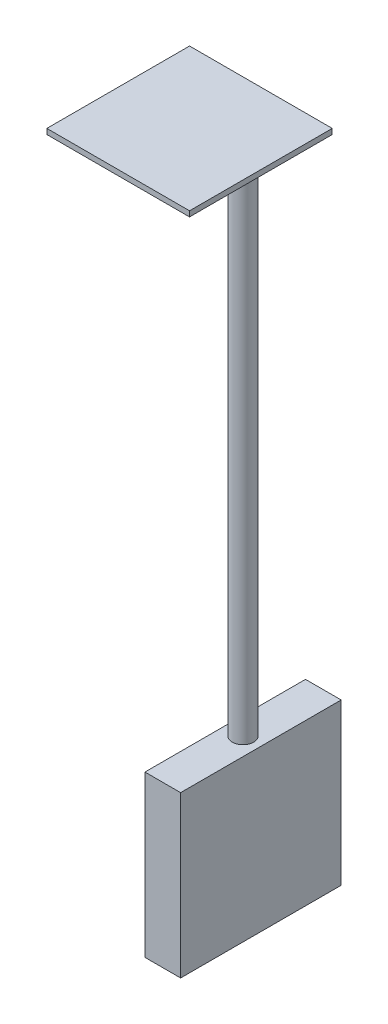
ISO-10303-21;
HEADER;
FILE_DESCRIPTION(('STEP AP214'),'2;1');
FILE_NAME('part.step','',(''),(''),'','','');
FILE_SCHEMA(('AUTOMOTIVE_DESIGN { 1 0 10303 214 1 1 1 1 }'));
ENDSEC;
DATA;
#1=APPLICATION_CONTEXT('core data for automotive mechanical design processes');
#2=APPLICATION_PROTOCOL_DEFINITION('international standard','automotive_design',2000,#1);
#3=PRODUCT_CONTEXT('',#1,'mechanical');
#4=PRODUCT('Part','Part','',(#3));
#5=PRODUCT_RELATED_PRODUCT_CATEGORY('part','',(#4));
#6=PRODUCT_DEFINITION_FORMATION('','',#4);
#7=PRODUCT_DEFINITION_CONTEXT('part definition',#1,'design');
#8=PRODUCT_DEFINITION('design','',#6,#7);
#9=PRODUCT_DEFINITION_SHAPE('','',#8);
#10=(LENGTH_UNIT() NAMED_UNIT(*) SI_UNIT(.MILLI.,.METRE.));
#11=(NAMED_UNIT(*) PLANE_ANGLE_UNIT() SI_UNIT($,.RADIAN.));
#12=(NAMED_UNIT(*) SI_UNIT($,.STERADIAN.) SOLID_ANGLE_UNIT());
#13=UNCERTAINTY_MEASURE_WITH_UNIT(LENGTH_MEASURE(1.E-05),#10,'distance_accuracy_value','');
#14=(GEOMETRIC_REPRESENTATION_CONTEXT(3) GLOBAL_UNCERTAINTY_ASSIGNED_CONTEXT((#13)) GLOBAL_UNIT_ASSIGNED_CONTEXT((#10,
#11,#12)) REPRESENTATION_CONTEXT('',''));
#15=CARTESIAN_POINT('',(0.,0.,0.));
#16=DIRECTION('',(0.,0.,1.));
#17=DIRECTION('',(1.,0.,0.));
#18=AXIS2_PLACEMENT_3D('',#15,#16,#17);
#19=CARTESIAN_POINT('',(20.,32.03596113666,-75.9293033438984));
#20=DIRECTION('',(0.,-1.,0.));
#21=DIRECTION('',(0.,0.,-1.));
#22=AXIS2_PLACEMENT_3D('',#19,#20,#21);
#23=PLANE('',#22);
#24=DIRECTION('',(0.,0.,1.));
#25=VECTOR('',#24,1.);
#26=CARTESIAN_POINT('',(0.,32.03596113666,-75.9293033438984));
#27=LINE('',#26,#25);
#28=CARTESIAN_POINT('',(0.,32.03596113666,-75.9293033438984));
#29=VERTEX_POINT('',#28);
#30=CARTESIAN_POINT('',(0.,32.0359611366599,14.0706966561016));
#31=VERTEX_POINT('',#30);
#32=EDGE_CURVE('E163',#29,#31,#27,.T.);
#33=ORIENTED_EDGE('',*,*,#32,.T.);
#34=DIRECTION('',(-1.,0.,0.));
#35=VECTOR('',#34,1.);
#36=CARTESIAN_POINT('',(20.,32.0359611366599,14.0706966561016));
#37=LINE('',#36,#35);
#38=CARTESIAN_POINT('',(20.,32.0359611366599,14.0706966561016));
#39=VERTEX_POINT('',#38);
#40=EDGE_CURVE('E170',#39,#31,#37,.T.);
#41=ORIENTED_EDGE('',*,*,#40,.F.);
#42=DIRECTION('',(0.,0.,1.));
#43=VECTOR('',#42,1.);
#44=CARTESIAN_POINT('',(20.,32.03596113666,-75.9293033438984));
#45=LINE('',#44,#43);
#46=CARTESIAN_POINT('',(20.,32.03596113666,-75.9293033438984));
#47=VERTEX_POINT('',#46);
#48=EDGE_CURVE('E81',#47,#39,#45,.T.);
#49=ORIENTED_EDGE('',*,*,#48,.F.);
#50=DIRECTION('',(-1.,0.,0.));
#51=VECTOR('',#50,1.);
#52=CARTESIAN_POINT('',(20.,32.03596113666,-75.9293033438984));
#53=LINE('',#52,#51);
#54=EDGE_CURVE('E41',#47,#29,#53,.T.);
#55=ORIENTED_EDGE('',*,*,#54,.T.);
#56=EDGE_LOOP('',(#33,#41,#49,#55));
#57=FACE_BOUND('',#56,.T.);
#58=CARTESIAN_POINT('',(10.,32.03596113666,-30.9293033438984));
#59=DIRECTION('',(0.,-1.,0.));
#60=DIRECTION('',(0.,0.,-1.));
#61=AXIS2_PLACEMENT_3D('',#58,#59,#60);
#62=CIRCLE('',#61,6.);
#63=CARTESIAN_POINT('',(10.,32.03596113666,-36.9293033438984));
#64=VERTEX_POINT('',#63);
#65=EDGE_CURVE('E11',#64,#64,#62,.F.);
#66=ORIENTED_EDGE('',*,*,#65,.F.);
#67=EDGE_LOOP('',(#66));
#68=FACE_BOUND('',#67,.T.);
#69=ADVANCED_FACE('F32',(#57,#68),#23,.F.);
#70=CARTESIAN_POINT('',(20.,32.03596113666,-75.9293033438984));
#71=DIRECTION('',(0.,0.,1.));
#72=DIRECTION('',(0.,-1.,0.));
#73=AXIS2_PLACEMENT_3D('',#70,#71,#72);
#74=PLANE('',#73);
#75=DIRECTION('',(0.,1.,0.));
#76=VECTOR('',#75,1.);
#77=CARTESIAN_POINT('',(0.,32.03596113666,-75.9293033438984));
#78=LINE('',#77,#76);
#79=CARTESIAN_POINT('',(0.,-57.96403886334,-75.9293033438984));
#80=VERTEX_POINT('',#79);
#81=EDGE_CURVE('E153',#80,#29,#78,.T.);
#82=ORIENTED_EDGE('',*,*,#81,.T.);
#83=ORIENTED_EDGE('',*,*,#54,.F.);
#84=DIRECTION('',(0.,1.,0.));
#85=VECTOR('',#84,1.);
#86=CARTESIAN_POINT('',(20.,32.03596113666,-75.9293033438984));
#87=LINE('',#86,#85);
#88=CARTESIAN_POINT('',(20.,-57.96403886334,-75.9293033438984));
#89=VERTEX_POINT('',#88);
#90=EDGE_CURVE('E154',#89,#47,#87,.T.);
#91=ORIENTED_EDGE('',*,*,#90,.F.);
#92=DIRECTION('',(-1.,0.,0.));
#93=VECTOR('',#92,1.);
#94=CARTESIAN_POINT('',(20.,-57.96403886334,-75.9293033438984));
#95=LINE('',#94,#93);
#96=EDGE_CURVE('E160',#89,#80,#95,.T.);
#97=ORIENTED_EDGE('',*,*,#96,.T.);
#98=EDGE_LOOP('',(#82,#83,#91,#97));
#99=FACE_BOUND('',#98,.T.);
#100=ADVANCED_FACE('F34',(#99),#74,.F.);
#101=CARTESIAN_POINT('',(20.,32.0359611366599,14.0706966561016));
#102=DIRECTION('',(0.,0.,-1.));
#103=DIRECTION('',(0.,1.,0.));
#104=AXIS2_PLACEMENT_3D('',#101,#102,#103);
#105=PLANE('',#104);
#106=DIRECTION('',(0.,-1.,0.));
#107=VECTOR('',#106,1.);
#108=CARTESIAN_POINT('',(0.,32.0359611366599,14.0706966561016));
#109=LINE('',#108,#107);
#110=CARTESIAN_POINT('',(0.,-57.9640388633401,14.0706966561016));
#111=VERTEX_POINT('',#110);
#112=EDGE_CURVE('E67',#31,#111,#109,.T.);
#113=ORIENTED_EDGE('',*,*,#112,.T.);
#114=DIRECTION('',(-1.,0.,0.));
#115=VECTOR('',#114,1.);
#116=CARTESIAN_POINT('',(20.,-57.9640388633401,14.0706966561016));
#117=LINE('',#116,#115);
#118=CARTESIAN_POINT('',(20.,-57.9640388633401,14.0706966561016));
#119=VERTEX_POINT('',#118);
#120=EDGE_CURVE('E168',#119,#111,#117,.T.);
#121=ORIENTED_EDGE('',*,*,#120,.F.);
#122=DIRECTION('',(0.,-1.,0.));
#123=VECTOR('',#122,1.);
#124=CARTESIAN_POINT('',(20.,32.0359611366599,14.0706966561016));
#125=LINE('',#124,#123);
#126=EDGE_CURVE('E157',#39,#119,#125,.T.);
#127=ORIENTED_EDGE('',*,*,#126,.F.);
#128=ORIENTED_EDGE('',*,*,#40,.T.);
#129=EDGE_LOOP('',(#113,#121,#127,#128));
#130=FACE_BOUND('',#129,.T.);
#131=ADVANCED_FACE('F196',(#130),#105,.F.);
#132=CARTESIAN_POINT('',(20.,-57.96403886334,-75.9293033438984));
#133=DIRECTION('',(0.,1.,0.));
#134=DIRECTION('',(0.,0.,1.));
#135=AXIS2_PLACEMENT_3D('',#132,#133,#134);
#136=PLANE('',#135);
#137=DIRECTION('',(0.,0.,-1.));
#138=VECTOR('',#137,1.);
#139=CARTESIAN_POINT('',(0.,-57.96403886334,-75.9293033438984));
#140=LINE('',#139,#138);
#141=EDGE_CURVE('E73',#111,#80,#140,.T.);
#142=ORIENTED_EDGE('',*,*,#141,.T.);
#143=ORIENTED_EDGE('',*,*,#96,.F.);
#144=DIRECTION('',(0.,0.,-1.));
#145=VECTOR('',#144,1.);
#146=CARTESIAN_POINT('',(20.,-57.96403886334,-75.9293033438984));
#147=LINE('',#146,#145);
#148=EDGE_CURVE('E49',#119,#89,#147,.T.);
#149=ORIENTED_EDGE('',*,*,#148,.F.);
#150=ORIENTED_EDGE('',*,*,#120,.T.);
#151=EDGE_LOOP('',(#142,#143,#149,#150));
#152=FACE_BOUND('',#151,.T.);
#153=ADVANCED_FACE('F189',(#152),#136,.F.);
#154=CARTESIAN_POINT('',(20.,0.,0.));
#155=DIRECTION('',(-1.,0.,0.));
#156=DIRECTION('',(0.,0.,1.));
#157=AXIS2_PLACEMENT_3D('',#154,#155,#156);
#158=PLANE('',#157);
#159=ORIENTED_EDGE('',*,*,#90,.T.);
#160=ORIENTED_EDGE('',*,*,#48,.T.);
#161=ORIENTED_EDGE('',*,*,#126,.T.);
#162=ORIENTED_EDGE('',*,*,#148,.T.);
#163=EDGE_LOOP('',(#159,#160,#161,#162));
#164=FACE_BOUND('',#163,.T.);
#165=ADVANCED_FACE('F180',(#164),#158,.F.);
#166=CARTESIAN_POINT('',(0.,0.,0.));
#167=DIRECTION('',(-1.,0.,0.));
#168=DIRECTION('',(0.,0.,1.));
#169=AXIS2_PLACEMENT_3D('',#166,#167,#168);
#170=PLANE('',#169);
#171=ORIENTED_EDGE('',*,*,#81,.F.);
#172=ORIENTED_EDGE('',*,*,#141,.F.);
#173=ORIENTED_EDGE('',*,*,#112,.F.);
#174=ORIENTED_EDGE('',*,*,#32,.F.);
#175=EDGE_LOOP('',(#171,#172,#173,#174));
#176=FACE_BOUND('',#175,.T.);
#177=ADVANCED_FACE('F177',(#176),#170,.T.);
#178=CARTESIAN_POINT('',(10.,309.03596113666,-30.9293033438984));
#179=DIRECTION('',(0.,-1.,0.));
#180=DIRECTION('',(0.,0.,-1.));
#181=AXIS2_PLACEMENT_3D('',#178,#179,#180);
#182=CYLINDRICAL_SURFACE('',#181,6.);
#183=CARTESIAN_POINT('',(10.,309.03596113666,-30.9293033438984));
#184=DIRECTION('',(0.,1.,0.));
#185=DIRECTION('',(0.,0.,1.));
#186=AXIS2_PLACEMENT_3D('',#183,#184,#185);
#187=CIRCLE('',#186,6.);
#188=CARTESIAN_POINT('',(10.,309.03596113666,-24.9293033438984));
#189=VERTEX_POINT('',#188);
#190=EDGE_CURVE('E118',#189,#189,#187,.T.);
#191=ORIENTED_EDGE('',*,*,#190,.F.);
#192=EDGE_LOOP('',(#191));
#193=FACE_BOUND('',#192,.T.);
#194=ORIENTED_EDGE('',*,*,#65,.T.);
#195=EDGE_LOOP('',(#194));
#196=FACE_BOUND('',#195,.T.);
#197=ADVANCED_FACE('F179',(#193,#196),#182,.T.);
#198=CARTESIAN_POINT('',(0.,309.03596113666,0.));
#199=DIRECTION('',(0.,-1.,0.));
#200=DIRECTION('',(0.,0.,-1.));
#201=AXIS2_PLACEMENT_3D('',#198,#199,#200);
#202=PLANE('',#201);
#203=DIRECTION('',(0.,0.,1.));
#204=VECTOR('',#203,1.);
#205=CARTESIAN_POINT('',(-60.,309.03596113666,9.07069665610164));
#206=LINE('',#205,#204);
#207=CARTESIAN_POINT('',(-60.,309.03596113666,-70.9293033438984));
#208=VERTEX_POINT('',#207);
#209=CARTESIAN_POINT('',(-60.,309.03596113666,9.07069665610164));
#210=VERTEX_POINT('',#209);
#211=EDGE_CURVE('E116',#208,#210,#206,.T.);
#212=ORIENTED_EDGE('',*,*,#211,.F.);
#213=DIRECTION('',(-1.,0.,0.));
#214=VECTOR('',#213,1.);
#215=CARTESIAN_POINT('',(-60.,309.03596113666,-70.9293033438984));
#216=LINE('',#215,#214);
#217=CARTESIAN_POINT('',(20.,309.03596113666,-70.9293033438984));
#218=VERTEX_POINT('',#217);
#219=EDGE_CURVE('E143',#218,#208,#216,.T.);
#220=ORIENTED_EDGE('',*,*,#219,.F.);
#221=DIRECTION('',(0.,0.,-1.));
#222=VECTOR('',#221,1.);
#223=CARTESIAN_POINT('',(20.,309.03596113666,9.07069665610164));
#224=LINE('',#223,#222);
#225=CARTESIAN_POINT('',(20.,309.03596113666,9.07069665610164));
#226=VERTEX_POINT('',#225);
#227=EDGE_CURVE('E141',#226,#218,#224,.T.);
#228=ORIENTED_EDGE('',*,*,#227,.F.);
#229=DIRECTION('',(1.,0.,0.));
#230=VECTOR('',#229,1.);
#231=CARTESIAN_POINT('',(-60.,309.03596113666,9.07069665610164));
#232=LINE('',#231,#230);
#233=EDGE_CURVE('E139',#210,#226,#232,.T.);
#234=ORIENTED_EDGE('',*,*,#233,.F.);
#235=EDGE_LOOP('',(#212,#220,#228,#234));
#236=FACE_BOUND('',#235,.T.);
#237=ORIENTED_EDGE('',*,*,#190,.T.);
#238=EDGE_LOOP('',(#237));
#239=FACE_BOUND('',#238,.T.);
#240=ADVANCED_FACE('F186',(#236,#239),#202,.T.);
#241=CARTESIAN_POINT('',(-60.,311.93596113666,9.07069665610164));
#242=DIRECTION('',(1.,0.,0.));
#243=DIRECTION('',(0.,0.,-1.));
#244=AXIS2_PLACEMENT_3D('',#241,#242,#243);
#245=PLANE('',#244);
#246=ORIENTED_EDGE('',*,*,#211,.T.);
#247=DIRECTION('',(0.,-1.,0.));
#248=VECTOR('',#247,1.);
#249=CARTESIAN_POINT('',(-60.,311.93596113666,9.07069665610164));
#250=LINE('',#249,#248);
#251=CARTESIAN_POINT('',(-60.,312.03596113666,9.07069665610164));
#252=VERTEX_POINT('',#251);
#253=EDGE_CURVE('E109',#252,#210,#250,.T.);
#254=ORIENTED_EDGE('',*,*,#253,.F.);
#255=DIRECTION('',(0.,0.,1.));
#256=VECTOR('',#255,1.);
#257=CARTESIAN_POINT('',(-60.,312.03596113666,-70.9293033438984));
#258=LINE('',#257,#256);
#259=CARTESIAN_POINT('',(-60.,312.03596113666,-70.9293033438984));
#260=VERTEX_POINT('',#259);
#261=EDGE_CURVE('E114',#260,#252,#258,.T.);
#262=ORIENTED_EDGE('',*,*,#261,.F.);
#263=DIRECTION('',(0.,-1.,0.));
#264=VECTOR('',#263,1.);
#265=CARTESIAN_POINT('',(-60.,311.93596113666,-70.9293033438984));
#266=LINE('',#265,#264);
#267=EDGE_CURVE('E145',#260,#208,#266,.T.);
#268=ORIENTED_EDGE('',*,*,#267,.T.);
#269=EDGE_LOOP('',(#246,#254,#262,#268));
#270=FACE_BOUND('',#269,.T.);
#271=ADVANCED_FACE('F111',(#270),#245,.F.);
#272=CARTESIAN_POINT('',(-60.,311.93596113666,9.07069665610164));
#273=DIRECTION('',(0.,0.,-1.));
#274=DIRECTION('',(0.,1.,0.));
#275=AXIS2_PLACEMENT_3D('',#272,#273,#274);
#276=PLANE('',#275);
#277=ORIENTED_EDGE('',*,*,#233,.T.);
#278=DIRECTION('',(0.,-1.,0.));
#279=VECTOR('',#278,1.);
#280=CARTESIAN_POINT('',(20.,311.93596113666,9.07069665610164));
#281=LINE('',#280,#279);
#282=CARTESIAN_POINT('',(20.,312.03596113666,9.07069665610164));
#283=VERTEX_POINT('',#282);
#284=EDGE_CURVE('E119',#283,#226,#281,.T.);
#285=ORIENTED_EDGE('',*,*,#284,.F.);
#286=DIRECTION('',(1.,0.,0.));
#287=VECTOR('',#286,1.);
#288=CARTESIAN_POINT('',(-60.,312.03596113666,9.07069665610164));
#289=LINE('',#288,#287);
#290=EDGE_CURVE('E122',#252,#283,#289,.T.);
#291=ORIENTED_EDGE('',*,*,#290,.F.);
#292=ORIENTED_EDGE('',*,*,#253,.T.);
#293=EDGE_LOOP('',(#277,#285,#291,#292));
#294=FACE_BOUND('',#293,.T.);
#295=ADVANCED_FACE('F123',(#294),#276,.F.);
#296=CARTESIAN_POINT('',(20.,311.93596113666,9.07069665610164));
#297=DIRECTION('',(-1.,0.,0.));
#298=DIRECTION('',(0.,0.,1.));
#299=AXIS2_PLACEMENT_3D('',#296,#297,#298);
#300=PLANE('',#299);
#301=ORIENTED_EDGE('',*,*,#227,.T.);
#302=DIRECTION('',(0.,-1.,0.));
#303=VECTOR('',#302,1.);
#304=CARTESIAN_POINT('',(20.,311.93596113666,-70.9293033438984));
#305=LINE('',#304,#303);
#306=CARTESIAN_POINT('',(20.,312.03596113666,-70.9293033438984));
#307=VERTEX_POINT('',#306);
#308=EDGE_CURVE('E147',#307,#218,#305,.T.);
#309=ORIENTED_EDGE('',*,*,#308,.F.);
#310=DIRECTION('',(0.,0.,-1.));
#311=VECTOR('',#310,1.);
#312=CARTESIAN_POINT('',(20.,312.03596113666,-70.9293033438984));
#313=LINE('',#312,#311);
#314=EDGE_CURVE('E128',#283,#307,#313,.T.);
#315=ORIENTED_EDGE('',*,*,#314,.F.);
#316=ORIENTED_EDGE('',*,*,#284,.T.);
#317=EDGE_LOOP('',(#301,#309,#315,#316));
#318=FACE_BOUND('',#317,.T.);
#319=ADVANCED_FACE('F250',(#318),#300,.F.);
#320=CARTESIAN_POINT('',(-60.,311.93596113666,-70.9293033438984));
#321=DIRECTION('',(0.,0.,1.));
#322=DIRECTION('',(0.,-1.,0.));
#323=AXIS2_PLACEMENT_3D('',#320,#321,#322);
#324=PLANE('',#323);
#325=ORIENTED_EDGE('',*,*,#219,.T.);
#326=ORIENTED_EDGE('',*,*,#267,.F.);
#327=DIRECTION('',(-1.,0.,0.));
#328=VECTOR('',#327,1.);
#329=CARTESIAN_POINT('',(-60.,312.03596113666,-70.9293033438984));
#330=LINE('',#329,#328);
#331=EDGE_CURVE('E133',#307,#260,#330,.T.);
#332=ORIENTED_EDGE('',*,*,#331,.F.);
#333=ORIENTED_EDGE('',*,*,#308,.T.);
#334=EDGE_LOOP('',(#325,#326,#332,#333));
#335=FACE_BOUND('',#334,.T.);
#336=ADVANCED_FACE('F260',(#335),#324,.F.);
#337=CARTESIAN_POINT('',(0.,312.03596113666,0.));
#338=DIRECTION('',(0.,1.,0.));
#339=DIRECTION('',(0.,0.,1.));
#340=AXIS2_PLACEMENT_3D('',#337,#338,#339);
#341=PLANE('',#340);
#342=ORIENTED_EDGE('',*,*,#261,.T.);
#343=ORIENTED_EDGE('',*,*,#290,.T.);
#344=ORIENTED_EDGE('',*,*,#314,.T.);
#345=ORIENTED_EDGE('',*,*,#331,.T.);
#346=EDGE_LOOP('',(#342,#343,#344,#345));
#347=FACE_BOUND('',#346,.T.);
#348=ADVANCED_FACE('F131',(#347),#341,.T.);
#349=CLOSED_SHELL('',(#69,#100,#131,#153,#165,#177,#197,#240,#271,#295,#319,#336,#348));
#350=MANIFOLD_SOLID_BREP('B2',#349);
#351=ADVANCED_BREP_SHAPE_REPRESENTATION('',(#18,#350),#14);
#352=SHAPE_DEFINITION_REPRESENTATION(#9,#351);
ENDSEC;
END-ISO-10303-21;
